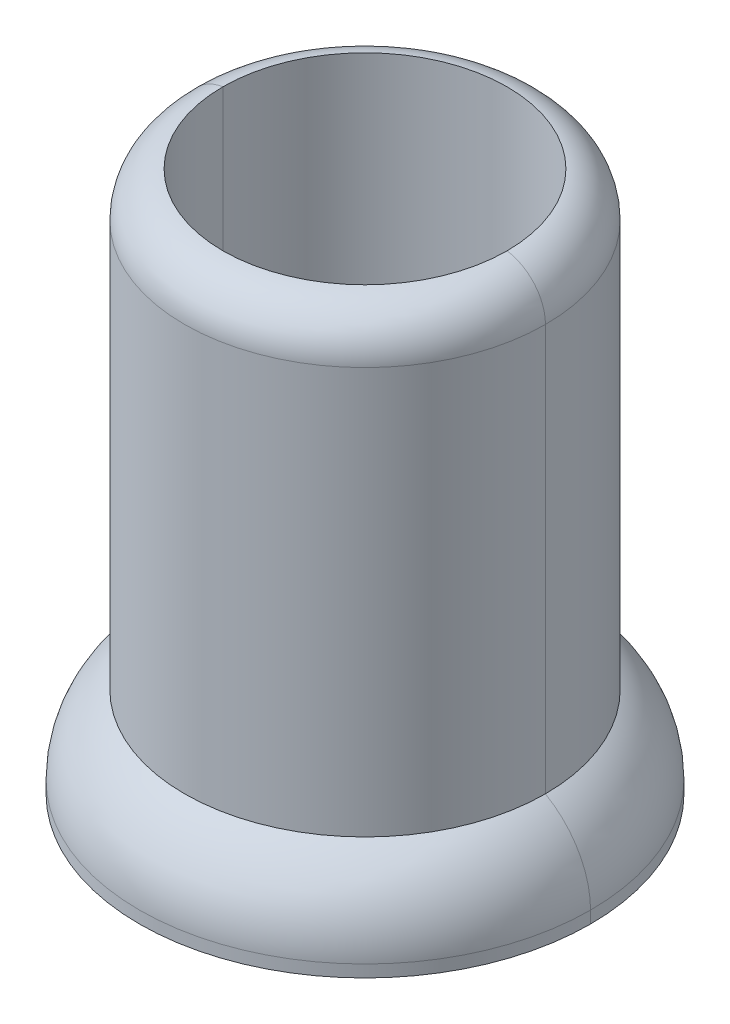
ISO-10303-21;
HEADER;
FILE_DESCRIPTION(('STEP AP214'),'2;1');
FILE_NAME('part.step','',(''),(''),'','','');
FILE_SCHEMA(('AUTOMOTIVE_DESIGN { 1 0 10303 214 1 1 1 1 }'));
ENDSEC;
DATA;
#1=APPLICATION_CONTEXT('core data for automotive mechanical design processes');
#2=APPLICATION_PROTOCOL_DEFINITION('international standard','automotive_design',2000,#1);
#3=PRODUCT_CONTEXT('',#1,'mechanical');
#4=PRODUCT('Part','Part','',(#3));
#5=PRODUCT_RELATED_PRODUCT_CATEGORY('part','',(#4));
#6=PRODUCT_DEFINITION_FORMATION('','',#4);
#7=PRODUCT_DEFINITION_CONTEXT('part definition',#1,'design');
#8=PRODUCT_DEFINITION('design','',#6,#7);
#9=PRODUCT_DEFINITION_SHAPE('','',#8);
#10=(LENGTH_UNIT() NAMED_UNIT(*) SI_UNIT(.MILLI.,.METRE.));
#11=(NAMED_UNIT(*) PLANE_ANGLE_UNIT() SI_UNIT($,.RADIAN.));
#12=(NAMED_UNIT(*) SI_UNIT($,.STERADIAN.) SOLID_ANGLE_UNIT());
#13=UNCERTAINTY_MEASURE_WITH_UNIT(LENGTH_MEASURE(1.E-05),#10,'distance_accuracy_value','');
#14=(GEOMETRIC_REPRESENTATION_CONTEXT(3) GLOBAL_UNCERTAINTY_ASSIGNED_CONTEXT((#13)) GLOBAL_UNIT_ASSIGNED_CONTEXT((#10,
#11,#12)) REPRESENTATION_CONTEXT('',''));
#15=CARTESIAN_POINT('',(0.,0.,0.));
#16=DIRECTION('',(0.,0.,1.));
#17=DIRECTION('',(1.,0.,0.));
#18=AXIS2_PLACEMENT_3D('',#15,#16,#17);
#19=CARTESIAN_POINT('',(5.,10.01,0.));
#20=DIRECTION('',(0.,0.,1.));
#21=DIRECTION('',(1.,0.,0.));
#22=AXIS2_PLACEMENT_3D('',#19,#20,#21);
#23=PLANE('',#22);
#24=CARTESIAN_POINT('',(3.,-1.73205080756888,0.));
#25=DIRECTION('',(0.,0.,1.));
#26=DIRECTION('',(1.,0.,0.));
#27=AXIS2_PLACEMENT_3D('',#24,#25,#26);
#28=CIRCLE('',#27,2.);
#29=CARTESIAN_POINT('',(4.,0.,0.));
#30=VERTEX_POINT('',#29);
#31=CARTESIAN_POINT('',(5.,-1.73205080756888,0.));
#32=VERTEX_POINT('',#31);
#33=EDGE_CURVE('E162',#30,#32,#28,.F.);
#34=ORIENTED_EDGE('',*,*,#33,.F.);
#35=DIRECTION('',(0.,-1.,0.));
#36=VECTOR('',#35,1.);
#37=CARTESIAN_POINT('',(4.,10.,0.));
#38=LINE('',#37,#36);
#39=CARTESIAN_POINT('',(4.,9.01131400333574,0.));
#40=VERTEX_POINT('',#39);
#41=EDGE_CURVE('E168',#30,#40,#38,.F.);
#42=ORIENTED_EDGE('',*,*,#41,.T.);
#43=CARTESIAN_POINT('',(3.,9.01131400333574,0.));
#44=DIRECTION('',(0.,0.,1.));
#45=DIRECTION('',(1.,0.,0.));
#46=AXIS2_PLACEMENT_3D('',#43,#44,#45);
#47=CIRCLE('',#46,1.);
#48=CARTESIAN_POINT('',(3.15000000000001,10.,0.));
#49=VERTEX_POINT('',#48);
#50=EDGE_CURVE('E79',#49,#40,#47,.F.);
#51=ORIENTED_EDGE('',*,*,#50,.F.);
#52=DIRECTION('',(0.,1.,0.));
#53=VECTOR('',#52,1.);
#54=CARTESIAN_POINT('',(3.15,-2.,0.));
#55=LINE('',#54,#53);
#56=CARTESIAN_POINT('',(3.15,-2.,0.));
#57=VERTEX_POINT('',#56);
#58=EDGE_CURVE('E114',#49,#57,#55,.F.);
#59=ORIENTED_EDGE('',*,*,#58,.T.);
#60=DIRECTION('',(-1.,0.,0.));
#61=VECTOR('',#60,1.);
#62=CARTESIAN_POINT('',(0.,-2.,0.));
#63=LINE('',#62,#61);
#64=CARTESIAN_POINT('',(5.,-2.,0.));
#65=VERTEX_POINT('',#64);
#66=EDGE_CURVE('E121',#65,#57,#63,.T.);
#67=ORIENTED_EDGE('',*,*,#66,.F.);
#68=DIRECTION('',(0.,1.,0.));
#69=VECTOR('',#68,1.);
#70=CARTESIAN_POINT('',(5.,-2.,0.));
#71=LINE('',#70,#69);
#72=EDGE_CURVE('E137',#65,#32,#71,.T.);
#73=ORIENTED_EDGE('',*,*,#72,.T.);
#74=EDGE_LOOP('',(#34,#42,#51,#59,#67,#73));
#75=FACE_BOUND('',#74,.T.);
#76=ADVANCED_FACE('F55',(#75),#23,.T.);
#77=CARTESIAN_POINT('',(-3.,-1.73205080756888,0.));
#78=DIRECTION('',(0.,0.,1.));
#79=DIRECTION('',(1.,0.,0.));
#80=AXIS2_PLACEMENT_3D('',#77,#78,#79);
#81=CIRCLE('',#80,2.);
#82=CARTESIAN_POINT('',(-5.,-1.73205080756888,0.));
#83=VERTEX_POINT('',#82);
#84=CARTESIAN_POINT('',(-4.,0.,0.));
#85=VERTEX_POINT('',#84);
#86=EDGE_CURVE('E159',#83,#85,#81,.F.);
#87=ORIENTED_EDGE('',*,*,#86,.F.);
#88=DIRECTION('',(0.,1.,0.));
#89=VECTOR('',#88,1.);
#90=CARTESIAN_POINT('',(-5.,-2.,0.));
#91=LINE('',#90,#89);
#92=CARTESIAN_POINT('',(-5.,-2.,0.));
#93=VERTEX_POINT('',#92);
#94=EDGE_CURVE('E132',#83,#93,#91,.F.);
#95=ORIENTED_EDGE('',*,*,#94,.T.);
#96=CARTESIAN_POINT('',(-3.15,-2.,0.));
#97=VERTEX_POINT('',#96);
#98=EDGE_CURVE('E128',#97,#93,#63,.T.);
#99=ORIENTED_EDGE('',*,*,#98,.F.);
#100=DIRECTION('',(0.,1.,0.));
#101=VECTOR('',#100,1.);
#102=CARTESIAN_POINT('',(-3.15,-2.,0.));
#103=LINE('',#102,#101);
#104=CARTESIAN_POINT('',(-3.15000000000001,10.,0.));
#105=VERTEX_POINT('',#104);
#106=EDGE_CURVE('E115',#97,#105,#103,.T.);
#107=ORIENTED_EDGE('',*,*,#106,.T.);
#108=CARTESIAN_POINT('',(-3.,9.01131400333574,0.));
#109=DIRECTION('',(0.,0.,1.));
#110=DIRECTION('',(1.,0.,0.));
#111=AXIS2_PLACEMENT_3D('',#108,#109,#110);
#112=CIRCLE('',#111,1.);
#113=CARTESIAN_POINT('',(-4.,9.01131400333574,0.));
#114=VERTEX_POINT('',#113);
#115=EDGE_CURVE('E71',#114,#105,#112,.F.);
#116=ORIENTED_EDGE('',*,*,#115,.F.);
#117=DIRECTION('',(0.,-1.,0.));
#118=VECTOR('',#117,1.);
#119=CARTESIAN_POINT('',(-4.,10.,0.));
#120=LINE('',#119,#118);
#121=EDGE_CURVE('E129',#114,#85,#120,.T.);
#122=ORIENTED_EDGE('',*,*,#121,.T.);
#123=EDGE_LOOP('',(#87,#95,#99,#107,#116,#122));
#124=FACE_BOUND('',#123,.T.);
#125=ADVANCED_FACE('F182',(#124),#23,.T.);
#126=CARTESIAN_POINT('',(0.,-2.,0.));
#127=DIRECTION('',(0.,-1.,0.));
#128=DIRECTION('',(0.,0.,-1.));
#129=AXIS2_PLACEMENT_3D('',#126,#127,#128);
#130=PLANE('',#129);
#131=CARTESIAN_POINT('',(0.,-2.,0.));
#132=DIRECTION('',(0.,-1.,0.));
#133=DIRECTION('',(0.,0.,-1.));
#134=AXIS2_PLACEMENT_3D('',#131,#132,#133);
#135=CIRCLE('',#134,5.);
#136=EDGE_CURVE('E119',#93,#65,#135,.T.);
#137=ORIENTED_EDGE('',*,*,#136,.T.);
#138=ORIENTED_EDGE('',*,*,#66,.T.);
#139=CARTESIAN_POINT('',(0.,-2.,0.));
#140=DIRECTION('',(0.,1.,0.));
#141=DIRECTION('',(0.,0.,1.));
#142=AXIS2_PLACEMENT_3D('',#139,#140,#141);
#143=CIRCLE('',#142,3.15);
#144=EDGE_CURVE('E64',#57,#97,#143,.T.);
#145=ORIENTED_EDGE('',*,*,#144,.T.);
#146=ORIENTED_EDGE('',*,*,#98,.T.);
#147=EDGE_LOOP('',(#137,#138,#145,#146));
#148=FACE_BOUND('',#147,.T.);
#149=ADVANCED_FACE('F122',(#148),#130,.T.);
#150=CARTESIAN_POINT('',(0.,-2.,0.));
#151=DIRECTION('',(0.,1.,0.));
#152=DIRECTION('',(0.,0.,1.));
#153=AXIS2_PLACEMENT_3D('',#150,#151,#152);
#154=CYLINDRICAL_SURFACE('',#153,5.);
#155=ORIENTED_EDGE('',*,*,#72,.F.);
#156=ORIENTED_EDGE('',*,*,#136,.F.);
#157=ORIENTED_EDGE('',*,*,#94,.F.);
#158=CARTESIAN_POINT('',(0.,-1.73205080756888,0.));
#159=DIRECTION('',(0.,1.,0.));
#160=DIRECTION('',(0.,0.,1.));
#161=AXIS2_PLACEMENT_3D('',#158,#159,#160);
#162=CIRCLE('',#161,5.);
#163=EDGE_CURVE('E146',#83,#32,#162,.F.);
#164=ORIENTED_EDGE('',*,*,#163,.T.);
#165=EDGE_LOOP('',(#155,#156,#157,#164));
#166=FACE_BOUND('',#165,.T.);
#167=ADVANCED_FACE('F176',(#166),#154,.T.);
#168=CARTESIAN_POINT('',(0.,10.,0.));
#169=DIRECTION('',(0.,-1.,0.));
#170=DIRECTION('',(0.,0.,-1.));
#171=AXIS2_PLACEMENT_3D('',#168,#169,#170);
#172=CYLINDRICAL_SURFACE('',#171,4.);
#173=ORIENTED_EDGE('',*,*,#121,.F.);
#174=CARTESIAN_POINT('',(0.,9.01131400333574,0.));
#175=DIRECTION('',(0.,1.,0.));
#176=DIRECTION('',(0.,0.,1.));
#177=AXIS2_PLACEMENT_3D('',#174,#175,#176);
#178=CIRCLE('',#177,4.);
#179=EDGE_CURVE('E142',#114,#40,#178,.F.);
#180=ORIENTED_EDGE('',*,*,#179,.T.);
#181=ORIENTED_EDGE('',*,*,#41,.F.);
#182=CARTESIAN_POINT('',(0.,0.,0.));
#183=DIRECTION('',(0.,1.,0.));
#184=DIRECTION('',(0.,0.,1.));
#185=AXIS2_PLACEMENT_3D('',#182,#183,#184);
#186=CIRCLE('',#185,4.);
#187=EDGE_CURVE('E150',#30,#85,#186,.T.);
#188=ORIENTED_EDGE('',*,*,#187,.T.);
#189=EDGE_LOOP('',(#173,#180,#181,#188));
#190=FACE_BOUND('',#189,.T.);
#191=ADVANCED_FACE('F181',(#190),#172,.T.);
#192=CARTESIAN_POINT('',(0.,-2.,0.));
#193=DIRECTION('',(0.,1.,0.));
#194=DIRECTION('',(0.,0.,1.));
#195=AXIS2_PLACEMENT_3D('',#192,#193,#194);
#196=CYLINDRICAL_SURFACE('',#195,3.15);
#197=ORIENTED_EDGE('',*,*,#58,.F.);
#198=CARTESIAN_POINT('',(0.,10.,0.));
#199=DIRECTION('',(0.,1.,0.));
#200=DIRECTION('',(0.,0.,1.));
#201=AXIS2_PLACEMENT_3D('',#198,#199,#200);
#202=CIRCLE('',#201,3.15);
#203=EDGE_CURVE('E12',#49,#105,#202,.T.);
#204=ORIENTED_EDGE('',*,*,#203,.T.);
#205=ORIENTED_EDGE('',*,*,#106,.F.);
#206=ORIENTED_EDGE('',*,*,#144,.F.);
#207=EDGE_LOOP('',(#197,#204,#205,#206));
#208=FACE_BOUND('',#207,.T.);
#209=ADVANCED_FACE('F112',(#208),#196,.F.);
#210=CARTESIAN_POINT('',(0.,9.01131400333574,0.));
#211=DIRECTION('',(0.,1.,0.));
#212=DIRECTION('',(0.,0.,1.));
#213=AXIS2_PLACEMENT_3D('',#210,#211,#212);
#214=TOROIDAL_SURFACE('',#213,3.,1.);
#215=ORIENTED_EDGE('',*,*,#203,.F.);
#216=ORIENTED_EDGE('',*,*,#50,.T.);
#217=ORIENTED_EDGE('',*,*,#179,.F.);
#218=ORIENTED_EDGE('',*,*,#115,.T.);
#219=EDGE_LOOP('',(#215,#216,#217,#218));
#220=FACE_BOUND('',#219,.T.);
#221=ADVANCED_FACE('F57',(#220),#214,.T.);
#222=CARTESIAN_POINT('',(0.,-1.73205080756888,0.));
#223=DIRECTION('',(0.,1.,0.));
#224=DIRECTION('',(0.,0.,1.));
#225=AXIS2_PLACEMENT_3D('',#222,#223,#224);
#226=TOROIDAL_SURFACE('',#225,3.,2.);
#227=ORIENTED_EDGE('',*,*,#187,.F.);
#228=ORIENTED_EDGE('',*,*,#33,.T.);
#229=ORIENTED_EDGE('',*,*,#163,.F.);
#230=ORIENTED_EDGE('',*,*,#86,.T.);
#231=EDGE_LOOP('',(#227,#228,#229,#230));
#232=FACE_BOUND('',#231,.T.);
#233=ADVANCED_FACE('F179',(#232),#226,.T.);
#234=CLOSED_SHELL('',(#76,#125,#149,#167,#191,#209,#221,#233));
#235=MANIFOLD_SOLID_BREP('B2',#234);
#236=CARTESIAN_POINT('',(5.,10.01,0.));
#237=DIRECTION('',(0.,0.,1.));
#238=DIRECTION('',(1.,0.,0.));
#239=AXIS2_PLACEMENT_3D('',#236,#237,#238);
#240=PLANE('',#239);
#241=CARTESIAN_POINT('',(3.,-1.73205080756888,0.));
#242=DIRECTION('',(0.,0.,1.));
#243=DIRECTION('',(1.,0.,0.));
#244=AXIS2_PLACEMENT_3D('',#241,#242,#243);
#245=CIRCLE('',#244,2.);
#246=CARTESIAN_POINT('',(4.,0.,0.));
#247=VERTEX_POINT('',#246);
#248=CARTESIAN_POINT('',(5.,-1.73205080756888,0.));
#249=VERTEX_POINT('',#248);
#250=EDGE_CURVE('E247',#247,#249,#245,.F.);
#251=ORIENTED_EDGE('',*,*,#250,.T.);
#252=DIRECTION('',(0.,1.,0.));
#253=VECTOR('',#252,1.);
#254=CARTESIAN_POINT('',(5.,-2.,0.));
#255=LINE('',#254,#253);
#256=CARTESIAN_POINT('',(5.,-2.,0.));
#257=VERTEX_POINT('',#256);
#258=EDGE_CURVE('E313',#257,#249,#255,.T.);
#259=ORIENTED_EDGE('',*,*,#258,.F.);
#260=DIRECTION('',(-1.,0.,0.));
#261=VECTOR('',#260,1.);
#262=CARTESIAN_POINT('',(0.,-2.,0.));
#263=LINE('',#262,#261);
#264=CARTESIAN_POINT('',(3.15,-2.,0.));
#265=VERTEX_POINT('',#264);
#266=EDGE_CURVE('E311',#257,#265,#263,.T.);
#267=ORIENTED_EDGE('',*,*,#266,.T.);
#268=DIRECTION('',(0.,1.,0.));
#269=VECTOR('',#268,1.);
#270=CARTESIAN_POINT('',(3.15,-2.,0.));
#271=LINE('',#270,#269);
#272=CARTESIAN_POINT('',(3.15000000000001,10.,0.));
#273=VERTEX_POINT('',#272);
#274=EDGE_CURVE('E300',#273,#265,#271,.F.);
#275=ORIENTED_EDGE('',*,*,#274,.F.);
#276=CARTESIAN_POINT('',(3.,9.01131400333574,0.));
#277=DIRECTION('',(0.,0.,1.));
#278=DIRECTION('',(1.,0.,0.));
#279=AXIS2_PLACEMENT_3D('',#276,#277,#278);
#280=CIRCLE('',#279,1.);
#281=CARTESIAN_POINT('',(4.,9.01131400333574,0.));
#282=VERTEX_POINT('',#281);
#283=EDGE_CURVE('E252',#273,#282,#280,.F.);
#284=ORIENTED_EDGE('',*,*,#283,.T.);
#285=DIRECTION('',(0.,-1.,0.));
#286=VECTOR('',#285,1.);
#287=CARTESIAN_POINT('',(4.,10.,0.));
#288=LINE('',#287,#286);
#289=EDGE_CURVE('E266',#247,#282,#288,.F.);
#290=ORIENTED_EDGE('',*,*,#289,.F.);
#291=EDGE_LOOP('',(#251,#259,#267,#275,#284,#290));
#292=FACE_BOUND('',#291,.T.);
#293=ADVANCED_FACE('F243',(#292),#240,.F.);
#294=CARTESIAN_POINT('',(-3.,-1.73205080756888,0.));
#295=DIRECTION('',(0.,0.,1.));
#296=DIRECTION('',(1.,0.,0.));
#297=AXIS2_PLACEMENT_3D('',#294,#295,#296);
#298=CIRCLE('',#297,2.);
#299=CARTESIAN_POINT('',(-5.,-1.73205080756888,0.));
#300=VERTEX_POINT('',#299);
#301=CARTESIAN_POINT('',(-4.,0.,0.));
#302=VERTEX_POINT('',#301);
#303=EDGE_CURVE('E335',#300,#302,#298,.F.);
#304=ORIENTED_EDGE('',*,*,#303,.T.);
#305=DIRECTION('',(0.,-1.,0.));
#306=VECTOR('',#305,1.);
#307=CARTESIAN_POINT('',(-4.,10.,0.));
#308=LINE('',#307,#306);
#309=CARTESIAN_POINT('',(-4.,9.01131400333574,0.));
#310=VERTEX_POINT('',#309);
#311=EDGE_CURVE('E318',#310,#302,#308,.T.);
#312=ORIENTED_EDGE('',*,*,#311,.F.);
#313=CARTESIAN_POINT('',(-3.,9.01131400333574,0.));
#314=DIRECTION('',(0.,0.,1.));
#315=DIRECTION('',(1.,0.,0.));
#316=AXIS2_PLACEMENT_3D('',#313,#314,#315);
#317=CIRCLE('',#316,1.);
#318=CARTESIAN_POINT('',(-3.15000000000001,10.,0.));
#319=VERTEX_POINT('',#318);
#320=EDGE_CURVE('E53',#310,#319,#317,.F.);
#321=ORIENTED_EDGE('',*,*,#320,.T.);
#322=DIRECTION('',(0.,1.,0.));
#323=VECTOR('',#322,1.);
#324=CARTESIAN_POINT('',(-3.15,-2.,0.));
#325=LINE('',#324,#323);
#326=CARTESIAN_POINT('',(-3.15,-2.,0.));
#327=VERTEX_POINT('',#326);
#328=EDGE_CURVE('E308',#327,#319,#325,.T.);
#329=ORIENTED_EDGE('',*,*,#328,.F.);
#330=CARTESIAN_POINT('',(-5.,-2.,0.));
#331=VERTEX_POINT('',#330);
#332=EDGE_CURVE('E317',#327,#331,#263,.T.);
#333=ORIENTED_EDGE('',*,*,#332,.T.);
#334=DIRECTION('',(0.,1.,0.));
#335=VECTOR('',#334,1.);
#336=CARTESIAN_POINT('',(-5.,-2.,0.));
#337=LINE('',#336,#335);
#338=EDGE_CURVE('E307',#300,#331,#337,.F.);
#339=ORIENTED_EDGE('',*,*,#338,.F.);
#340=EDGE_LOOP('',(#304,#312,#321,#329,#333,#339));
#341=FACE_BOUND('',#340,.T.);
#342=ADVANCED_FACE('F245',(#341),#240,.F.);
#343=CARTESIAN_POINT('',(0.,10.,0.));
#344=DIRECTION('',(0.,-1.,0.));
#345=DIRECTION('',(0.,0.,-1.));
#346=AXIS2_PLACEMENT_3D('',#343,#344,#345);
#347=CYLINDRICAL_SURFACE('',#346,4.);
#348=CARTESIAN_POINT('',(0.,9.01131400333574,0.));
#349=DIRECTION('',(0.,1.,0.));
#350=DIRECTION('',(0.,0.,1.));
#351=AXIS2_PLACEMENT_3D('',#348,#349,#350);
#352=CIRCLE('',#351,4.);
#353=EDGE_CURVE('E333',#282,#310,#352,.F.);
#354=ORIENTED_EDGE('',*,*,#353,.T.);
#355=ORIENTED_EDGE('',*,*,#311,.T.);
#356=CARTESIAN_POINT('',(0.,0.,0.));
#357=DIRECTION('',(0.,1.,0.));
#358=DIRECTION('',(0.,0.,1.));
#359=AXIS2_PLACEMENT_3D('',#356,#357,#358);
#360=CIRCLE('',#359,4.);
#361=EDGE_CURVE('E325',#302,#247,#360,.T.);
#362=ORIENTED_EDGE('',*,*,#361,.T.);
#363=ORIENTED_EDGE('',*,*,#289,.T.);
#364=EDGE_LOOP('',(#354,#355,#362,#363));
#365=FACE_BOUND('',#364,.T.);
#366=ADVANCED_FACE('F352',(#365),#347,.T.);
#367=CARTESIAN_POINT('',(0.,-2.,0.));
#368=DIRECTION('',(0.,1.,0.));
#369=DIRECTION('',(0.,0.,1.));
#370=AXIS2_PLACEMENT_3D('',#367,#368,#369);
#371=CYLINDRICAL_SURFACE('',#370,5.);
#372=CARTESIAN_POINT('',(0.,-2.,0.));
#373=DIRECTION('',(0.,-1.,0.));
#374=DIRECTION('',(0.,0.,-1.));
#375=AXIS2_PLACEMENT_3D('',#372,#373,#374);
#376=CIRCLE('',#375,5.);
#377=EDGE_CURVE('E323',#257,#331,#376,.T.);
#378=ORIENTED_EDGE('',*,*,#377,.F.);
#379=ORIENTED_EDGE('',*,*,#258,.T.);
#380=CARTESIAN_POINT('',(0.,-1.73205080756888,0.));
#381=DIRECTION('',(0.,1.,0.));
#382=DIRECTION('',(0.,0.,1.));
#383=AXIS2_PLACEMENT_3D('',#380,#381,#382);
#384=CIRCLE('',#383,5.);
#385=EDGE_CURVE('E330',#249,#300,#384,.F.);
#386=ORIENTED_EDGE('',*,*,#385,.T.);
#387=ORIENTED_EDGE('',*,*,#338,.T.);
#388=EDGE_LOOP('',(#378,#379,#386,#387));
#389=FACE_BOUND('',#388,.T.);
#390=ADVANCED_FACE('F350',(#389),#371,.T.);
#391=CARTESIAN_POINT('',(0.,-2.,0.));
#392=DIRECTION('',(0.,-1.,0.));
#393=DIRECTION('',(0.,0.,-1.));
#394=AXIS2_PLACEMENT_3D('',#391,#392,#393);
#395=PLANE('',#394);
#396=ORIENTED_EDGE('',*,*,#266,.F.);
#397=ORIENTED_EDGE('',*,*,#377,.T.);
#398=ORIENTED_EDGE('',*,*,#332,.F.);
#399=CARTESIAN_POINT('',(0.,-2.,0.));
#400=DIRECTION('',(0.,1.,0.));
#401=DIRECTION('',(0.,0.,1.));
#402=AXIS2_PLACEMENT_3D('',#399,#400,#401);
#403=CIRCLE('',#402,3.15);
#404=EDGE_CURVE('E304',#327,#265,#403,.T.);
#405=ORIENTED_EDGE('',*,*,#404,.T.);
#406=EDGE_LOOP('',(#396,#397,#398,#405));
#407=FACE_BOUND('',#406,.T.);
#408=ADVANCED_FACE('F320',(#407),#395,.T.);
#409=CARTESIAN_POINT('',(0.,-2.,0.));
#410=DIRECTION('',(0.,1.,0.));
#411=DIRECTION('',(0.,0.,1.));
#412=AXIS2_PLACEMENT_3D('',#409,#410,#411);
#413=CYLINDRICAL_SURFACE('',#412,3.15);
#414=CARTESIAN_POINT('',(0.,10.,0.));
#415=DIRECTION('',(0.,1.,0.));
#416=DIRECTION('',(0.,0.,1.));
#417=AXIS2_PLACEMENT_3D('',#414,#415,#416);
#418=CIRCLE('',#417,3.15);
#419=EDGE_CURVE('E305',#319,#273,#418,.T.);
#420=ORIENTED_EDGE('',*,*,#419,.T.);
#421=ORIENTED_EDGE('',*,*,#274,.T.);
#422=ORIENTED_EDGE('',*,*,#404,.F.);
#423=ORIENTED_EDGE('',*,*,#328,.T.);
#424=EDGE_LOOP('',(#420,#421,#422,#423));
#425=FACE_BOUND('',#424,.T.);
#426=ADVANCED_FACE('F302',(#425),#413,.F.);
#427=CARTESIAN_POINT('',(0.,-1.73205080756888,0.));
#428=DIRECTION('',(0.,1.,0.));
#429=DIRECTION('',(0.,0.,1.));
#430=AXIS2_PLACEMENT_3D('',#427,#428,#429);
#431=TOROIDAL_SURFACE('',#430,3.,2.);
#432=ORIENTED_EDGE('',*,*,#250,.F.);
#433=ORIENTED_EDGE('',*,*,#361,.F.);
#434=ORIENTED_EDGE('',*,*,#303,.F.);
#435=ORIENTED_EDGE('',*,*,#385,.F.);
#436=EDGE_LOOP('',(#432,#433,#434,#435));
#437=FACE_BOUND('',#436,.T.);
#438=ADVANCED_FACE('F348',(#437),#431,.T.);
#439=CARTESIAN_POINT('',(0.,9.01131400333574,0.));
#440=DIRECTION('',(0.,1.,0.));
#441=DIRECTION('',(0.,0.,1.));
#442=AXIS2_PLACEMENT_3D('',#439,#440,#441);
#443=TOROIDAL_SURFACE('',#442,3.,1.);
#444=ORIENTED_EDGE('',*,*,#283,.F.);
#445=ORIENTED_EDGE('',*,*,#419,.F.);
#446=ORIENTED_EDGE('',*,*,#320,.F.);
#447=ORIENTED_EDGE('',*,*,#353,.F.);
#448=EDGE_LOOP('',(#444,#445,#446,#447));
#449=FACE_BOUND('',#448,.T.);
#450=ADVANCED_FACE('F351',(#449),#443,.T.);
#451=CLOSED_SHELL('',(#293,#342,#366,#390,#408,#426,#438,#450));
#452=MANIFOLD_SOLID_BREP('B6',#451);
#453=ADVANCED_BREP_SHAPE_REPRESENTATION('',(#18,#235,#452),#14);
#454=SHAPE_DEFINITION_REPRESENTATION(#9,#453);
ENDSEC;
END-ISO-10303-21;
